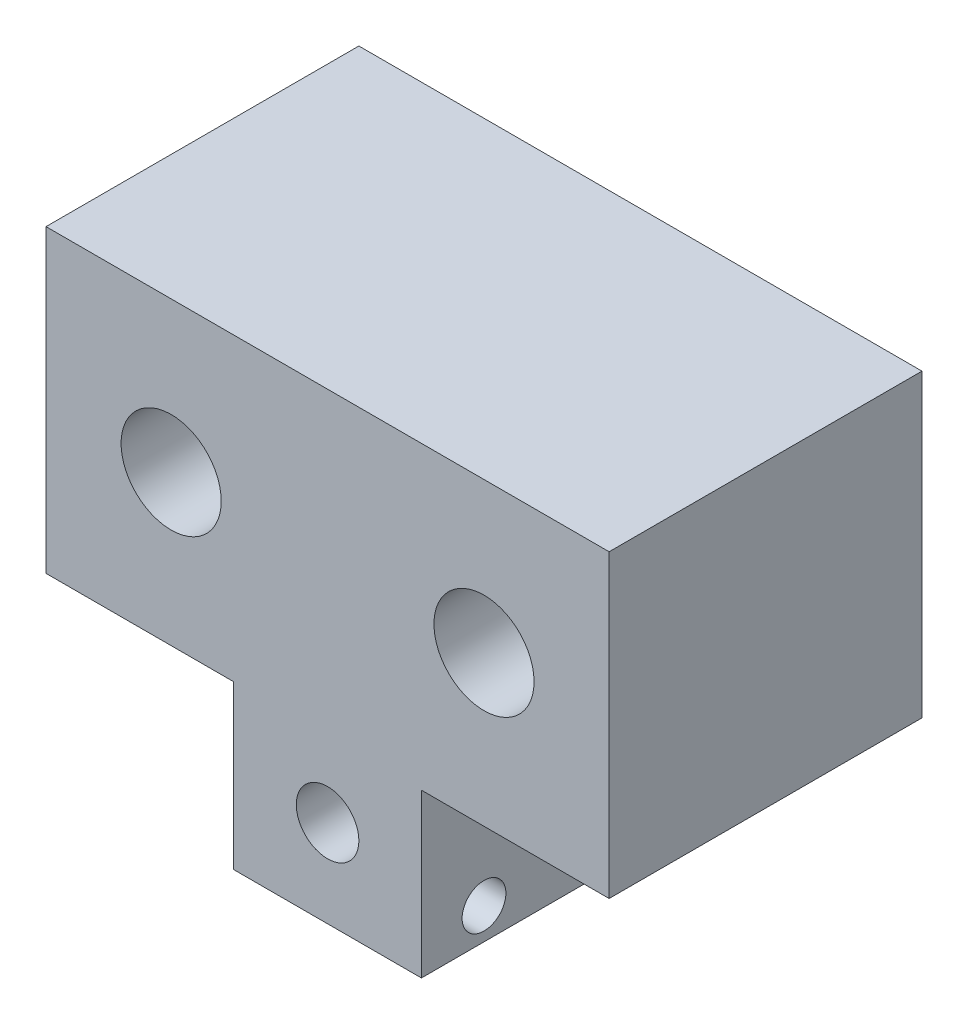
ISO-10303-21;
HEADER;
FILE_DESCRIPTION(('STEP AP214'),'2;1');
FILE_NAME('part.step','',(''),(''),'','','');
FILE_SCHEMA(('AUTOMOTIVE_DESIGN { 1 0 10303 214 1 1 1 1 }'));
ENDSEC;
DATA;
#1=APPLICATION_CONTEXT('core data for automotive mechanical design processes');
#2=APPLICATION_PROTOCOL_DEFINITION('international standard','automotive_design',2000,#1);
#3=PRODUCT_CONTEXT('',#1,'mechanical');
#4=PRODUCT('Part','Part','',(#3));
#5=PRODUCT_RELATED_PRODUCT_CATEGORY('part','',(#4));
#6=PRODUCT_DEFINITION_FORMATION('','',#4);
#7=PRODUCT_DEFINITION_CONTEXT('part definition',#1,'design');
#8=PRODUCT_DEFINITION('design','',#6,#7);
#9=PRODUCT_DEFINITION_SHAPE('','',#8);
#10=(LENGTH_UNIT() NAMED_UNIT(*) SI_UNIT(.MILLI.,.METRE.));
#11=(NAMED_UNIT(*) PLANE_ANGLE_UNIT() SI_UNIT($,.RADIAN.));
#12=(NAMED_UNIT(*) SI_UNIT($,.STERADIAN.) SOLID_ANGLE_UNIT());
#13=UNCERTAINTY_MEASURE_WITH_UNIT(LENGTH_MEASURE(1.E-05),#10,'distance_accuracy_value','');
#14=(GEOMETRIC_REPRESENTATION_CONTEXT(3) GLOBAL_UNCERTAINTY_ASSIGNED_CONTEXT((#13)) GLOBAL_UNIT_ASSIGNED_CONTEXT((#10,
#11,#12)) REPRESENTATION_CONTEXT('',''));
#15=CARTESIAN_POINT('',(0.,0.,0.));
#16=DIRECTION('',(0.,0.,1.));
#17=DIRECTION('',(1.,0.,0.));
#18=AXIS2_PLACEMENT_3D('',#15,#16,#17);
#19=CARTESIAN_POINT('',(-18.3023859270742,-12.216957605985,25.));
#20=DIRECTION('',(0.,1.,0.));
#21=DIRECTION('',(0.,0.,1.));
#22=AXIS2_PLACEMENT_3D('',#19,#20,#21);
#23=PLANE('',#22);
#24=DIRECTION('',(0.,0.,1.));
#25=VECTOR('',#24,1.);
#26=CARTESIAN_POINT('',(11.6976140729258,-12.216957605985,5.));
#27=LINE('',#26,#25);
#28=CARTESIAN_POINT('',(11.6976140729258,-12.216957605985,5.));
#29=VERTEX_POINT('',#28);
#30=CARTESIAN_POINT('',(11.6976140729258,-12.216957605985,25.));
#31=VERTEX_POINT('',#30);
#32=EDGE_CURVE('E145',#29,#31,#27,.T.);
#33=ORIENTED_EDGE('',*,*,#32,.F.);
#34=DIRECTION('',(-1.,0.,0.));
#35=VECTOR('',#34,1.);
#36=CARTESIAN_POINT('',(-3.30238592707421,-12.216957605985,5.));
#37=LINE('',#36,#35);
#38=CARTESIAN_POINT('',(-3.30238592707421,-12.216957605985,5.));
#39=VERTEX_POINT('',#38);
#40=EDGE_CURVE('E117',#29,#39,#37,.T.);
#41=ORIENTED_EDGE('',*,*,#40,.T.);
#42=DIRECTION('',(0.,0.,1.));
#43=VECTOR('',#42,1.);
#44=CARTESIAN_POINT('',(-3.30238592707421,-12.216957605985,5.));
#45=LINE('',#44,#43);
#46=CARTESIAN_POINT('',(-3.30238592707421,-12.216957605985,25.));
#47=VERTEX_POINT('',#46);
#48=EDGE_CURVE('E129',#39,#47,#45,.T.);
#49=ORIENTED_EDGE('',*,*,#48,.T.);
#50=DIRECTION('',(1.,0.,0.));
#51=VECTOR('',#50,1.);
#52=CARTESIAN_POINT('',(-18.3023859270742,-12.216957605985,25.));
#53=LINE('',#52,#51);
#54=CARTESIAN_POINT('',(-18.3023859270742,-12.216957605985,25.));
#55=VERTEX_POINT('',#54);
#56=EDGE_CURVE('E86',#55,#47,#53,.T.);
#57=ORIENTED_EDGE('',*,*,#56,.F.);
#58=DIRECTION('',(0.,0.,-1.));
#59=VECTOR('',#58,1.);
#60=CARTESIAN_POINT('',(-18.3023859270742,-12.216957605985,25.));
#61=LINE('',#60,#59);
#62=CARTESIAN_POINT('',(-18.3023859270742,-12.216957605985,0.));
#63=VERTEX_POINT('',#62);
#64=EDGE_CURVE('E11',#55,#63,#61,.T.);
#65=ORIENTED_EDGE('',*,*,#64,.T.);
#66=DIRECTION('',(1.,0.,0.));
#67=VECTOR('',#66,1.);
#68=CARTESIAN_POINT('',(-18.3023859270742,-12.216957605985,0.));
#69=LINE('',#68,#67);
#70=CARTESIAN_POINT('',(26.6976140729258,-12.216957605985,0.));
#71=VERTEX_POINT('',#70);
#72=EDGE_CURVE('E170',#63,#71,#69,.T.);
#73=ORIENTED_EDGE('',*,*,#72,.T.);
#74=DIRECTION('',(0.,0.,-1.));
#75=VECTOR('',#74,1.);
#76=CARTESIAN_POINT('',(26.6976140729258,-12.216957605985,25.));
#77=LINE('',#76,#75);
#78=CARTESIAN_POINT('',(26.6976140729258,-12.216957605985,25.));
#79=VERTEX_POINT('',#78);
#80=EDGE_CURVE('E43',#79,#71,#77,.T.);
#81=ORIENTED_EDGE('',*,*,#80,.F.);
#82=EDGE_CURVE('E162',#31,#79,#53,.T.);
#83=ORIENTED_EDGE('',*,*,#82,.F.);
#84=EDGE_LOOP('',(#33,#41,#49,#57,#65,#73,#81,#83));
#85=FACE_BOUND('',#84,.T.);
#86=ADVANCED_FACE('F34',(#85),#23,.F.);
#87=CARTESIAN_POINT('',(0.,0.,25.));
#88=DIRECTION('',(0.,0.,1.));
#89=DIRECTION('',(1.,0.,0.));
#90=AXIS2_PLACEMENT_3D('',#87,#88,#89);
#91=PLANE('',#90);
#92=CARTESIAN_POINT('',(-8.30238592707421,-0.216957605985042,25.));
#93=DIRECTION('',(0.,0.,1.));
#94=DIRECTION('',(1.,0.,0.));
#95=AXIS2_PLACEMENT_3D('',#92,#93,#94);
#96=CIRCLE('',#95,4.);
#97=CARTESIAN_POINT('',(-4.30238592707421,-0.216957605985042,25.));
#98=VERTEX_POINT('',#97);
#99=EDGE_CURVE('E154',#98,#98,#96,.T.);
#100=ORIENTED_EDGE('',*,*,#99,.F.);
#101=EDGE_LOOP('',(#100));
#102=FACE_BOUND('',#101,.T.);
#103=DIRECTION('',(0.,-1.,0.));
#104=VECTOR('',#103,1.);
#105=CARTESIAN_POINT('',(-18.3023859270742,11.783042394015,25.));
#106=LINE('',#105,#104);
#107=CARTESIAN_POINT('',(-18.3023859270742,11.783042394015,25.));
#108=VERTEX_POINT('',#107);
#109=EDGE_CURVE('E160',#108,#55,#106,.T.);
#110=ORIENTED_EDGE('',*,*,#109,.T.);
#111=ORIENTED_EDGE('',*,*,#56,.T.);
#112=DIRECTION('',(0.,-1.,0.));
#113=VECTOR('',#112,1.);
#114=CARTESIAN_POINT('',(-3.30238592707421,-25.216957605985,25.));
#115=LINE('',#114,#113);
#116=CARTESIAN_POINT('',(-3.30238592707421,-25.216957605985,25.));
#117=VERTEX_POINT('',#116);
#118=EDGE_CURVE('E50',#47,#117,#115,.T.);
#119=ORIENTED_EDGE('',*,*,#118,.T.);
#120=DIRECTION('',(1.,0.,0.));
#121=VECTOR('',#120,1.);
#122=CARTESIAN_POINT('',(-3.30238592707421,-25.216957605985,25.));
#123=LINE('',#122,#121);
#124=CARTESIAN_POINT('',(11.6976140729258,-25.216957605985,25.));
#125=VERTEX_POINT('',#124);
#126=EDGE_CURVE('E114',#117,#125,#123,.T.);
#127=ORIENTED_EDGE('',*,*,#126,.T.);
#128=DIRECTION('',(0.,1.,0.));
#129=VECTOR('',#128,1.);
#130=CARTESIAN_POINT('',(11.6976140729258,-25.216957605985,25.));
#131=LINE('',#130,#129);
#132=EDGE_CURVE('E130',#125,#31,#131,.T.);
#133=ORIENTED_EDGE('',*,*,#132,.T.);
#134=ORIENTED_EDGE('',*,*,#82,.T.);
#135=DIRECTION('',(0.,1.,0.));
#136=VECTOR('',#135,1.);
#137=CARTESIAN_POINT('',(26.6976140729258,11.783042394015,25.));
#138=LINE('',#137,#136);
#139=CARTESIAN_POINT('',(26.6976140729258,11.783042394015,25.));
#140=VERTEX_POINT('',#139);
#141=EDGE_CURVE('E164',#79,#140,#138,.T.);
#142=ORIENTED_EDGE('',*,*,#141,.T.);
#143=DIRECTION('',(-1.,0.,0.));
#144=VECTOR('',#143,1.);
#145=CARTESIAN_POINT('',(-18.3023859270742,11.783042394015,25.));
#146=LINE('',#145,#144);
#147=EDGE_CURVE('E59',#140,#108,#146,.T.);
#148=ORIENTED_EDGE('',*,*,#147,.T.);
#149=EDGE_LOOP('',(#110,#111,#119,#127,#133,#134,#142,#148));
#150=FACE_BOUND('',#149,.T.);
#151=CARTESIAN_POINT('',(16.6976140729258,-0.216957605985042,25.));
#152=DIRECTION('',(0.,0.,1.));
#153=DIRECTION('',(1.,0.,0.));
#154=AXIS2_PLACEMENT_3D('',#151,#152,#153);
#155=CIRCLE('',#154,4.);
#156=CARTESIAN_POINT('',(20.6976140729258,-0.216957605985042,25.));
#157=VERTEX_POINT('',#156);
#158=EDGE_CURVE('E148',#157,#157,#155,.T.);
#159=ORIENTED_EDGE('',*,*,#158,.F.);
#160=EDGE_LOOP('',(#159));
#161=FACE_BOUND('',#160,.T.);
#162=CARTESIAN_POINT('',(4.19761407292579,-18.216957605985,25.));
#163=DIRECTION('',(0.,0.,1.));
#164=DIRECTION('',(1.,0.,0.));
#165=AXIS2_PLACEMENT_3D('',#162,#163,#164);
#166=CIRCLE('',#165,2.5);
#167=CARTESIAN_POINT('',(6.69761407292579,-18.216957605985,25.));
#168=VERTEX_POINT('',#167);
#169=EDGE_CURVE('E135',#168,#168,#166,.T.);
#170=ORIENTED_EDGE('',*,*,#169,.F.);
#171=EDGE_LOOP('',(#170));
#172=FACE_BOUND('',#171,.T.);
#173=ADVANCED_FACE('F207',(#102,#150,#161,#172),#91,.T.);
#174=CARTESIAN_POINT('',(0.,0.,0.));
#175=DIRECTION('',(0.,0.,1.));
#176=DIRECTION('',(1.,0.,0.));
#177=AXIS2_PLACEMENT_3D('',#174,#175,#176);
#178=PLANE('',#177);
#179=DIRECTION('',(0.,-1.,0.));
#180=VECTOR('',#179,1.);
#181=CARTESIAN_POINT('',(-18.3023859270742,11.783042394015,0.));
#182=LINE('',#181,#180);
#183=CARTESIAN_POINT('',(-18.3023859270742,11.783042394015,0.));
#184=VERTEX_POINT('',#183);
#185=EDGE_CURVE('E157',#184,#63,#182,.T.);
#186=ORIENTED_EDGE('',*,*,#185,.F.);
#187=DIRECTION('',(-1.,0.,0.));
#188=VECTOR('',#187,1.);
#189=CARTESIAN_POINT('',(-18.3023859270742,11.783042394015,0.));
#190=LINE('',#189,#188);
#191=CARTESIAN_POINT('',(26.6976140729258,11.783042394015,0.));
#192=VERTEX_POINT('',#191);
#193=EDGE_CURVE('E80',#192,#184,#190,.T.);
#194=ORIENTED_EDGE('',*,*,#193,.F.);
#195=DIRECTION('',(0.,1.,0.));
#196=VECTOR('',#195,1.);
#197=CARTESIAN_POINT('',(26.6976140729258,11.783042394015,0.));
#198=LINE('',#197,#196);
#199=EDGE_CURVE('E172',#71,#192,#198,.T.);
#200=ORIENTED_EDGE('',*,*,#199,.F.);
#201=ORIENTED_EDGE('',*,*,#72,.F.);
#202=EDGE_LOOP('',(#186,#194,#200,#201));
#203=FACE_BOUND('',#202,.T.);
#204=CARTESIAN_POINT('',(-8.30238592707421,-0.216957605985042,0.));
#205=DIRECTION('',(0.,0.,1.));
#206=DIRECTION('',(1.,0.,0.));
#207=AXIS2_PLACEMENT_3D('',#204,#205,#206);
#208=CIRCLE('',#207,4.);
#209=CARTESIAN_POINT('',(-4.30238592707421,-0.216957605985042,0.));
#210=VERTEX_POINT('',#209);
#211=EDGE_CURVE('E151',#210,#210,#208,.T.);
#212=ORIENTED_EDGE('',*,*,#211,.T.);
#213=EDGE_LOOP('',(#212));
#214=FACE_BOUND('',#213,.T.);
#215=CARTESIAN_POINT('',(16.6976140729258,-0.216957605985042,0.));
#216=DIRECTION('',(0.,0.,1.));
#217=DIRECTION('',(1.,0.,0.));
#218=AXIS2_PLACEMENT_3D('',#215,#216,#217);
#219=CIRCLE('',#218,4.);
#220=CARTESIAN_POINT('',(20.6976140729258,-0.216957605985042,0.));
#221=VERTEX_POINT('',#220);
#222=EDGE_CURVE('E144',#221,#221,#219,.T.);
#223=ORIENTED_EDGE('',*,*,#222,.T.);
#224=EDGE_LOOP('',(#223));
#225=FACE_BOUND('',#224,.T.);
#226=ADVANCED_FACE('F188',(#203,#214,#225),#178,.F.);
#227=CARTESIAN_POINT('',(-18.3023859270742,11.783042394015,25.));
#228=DIRECTION('',(1.,0.,0.));
#229=DIRECTION('',(0.,0.,-1.));
#230=AXIS2_PLACEMENT_3D('',#227,#228,#229);
#231=PLANE('',#230);
#232=ORIENTED_EDGE('',*,*,#185,.T.);
#233=ORIENTED_EDGE('',*,*,#64,.F.);
#234=ORIENTED_EDGE('',*,*,#109,.F.);
#235=DIRECTION('',(0.,0.,-1.));
#236=VECTOR('',#235,1.);
#237=CARTESIAN_POINT('',(-18.3023859270742,11.783042394015,25.));
#238=LINE('',#237,#236);
#239=EDGE_CURVE('E167',#108,#184,#238,.T.);
#240=ORIENTED_EDGE('',*,*,#239,.T.);
#241=EDGE_LOOP('',(#232,#233,#234,#240));
#242=FACE_BOUND('',#241,.T.);
#243=ADVANCED_FACE('F36',(#242),#231,.F.);
#244=CARTESIAN_POINT('',(26.6976140729258,11.783042394015,25.));
#245=DIRECTION('',(-1.,0.,0.));
#246=DIRECTION('',(0.,-1.,0.));
#247=AXIS2_PLACEMENT_3D('',#244,#245,#246);
#248=PLANE('',#247);
#249=ORIENTED_EDGE('',*,*,#199,.T.);
#250=DIRECTION('',(0.,0.,-1.));
#251=VECTOR('',#250,1.);
#252=CARTESIAN_POINT('',(26.6976140729258,11.783042394015,25.));
#253=LINE('',#252,#251);
#254=EDGE_CURVE('E176',#140,#192,#253,.T.);
#255=ORIENTED_EDGE('',*,*,#254,.F.);
#256=ORIENTED_EDGE('',*,*,#141,.F.);
#257=ORIENTED_EDGE('',*,*,#80,.T.);
#258=EDGE_LOOP('',(#249,#255,#256,#257));
#259=FACE_BOUND('',#258,.T.);
#260=ADVANCED_FACE('F183',(#259),#248,.F.);
#261=CARTESIAN_POINT('',(-18.3023859270742,11.783042394015,25.));
#262=DIRECTION('',(0.,-1.,0.));
#263=DIRECTION('',(0.,0.,-1.));
#264=AXIS2_PLACEMENT_3D('',#261,#262,#263);
#265=PLANE('',#264);
#266=ORIENTED_EDGE('',*,*,#193,.T.);
#267=ORIENTED_EDGE('',*,*,#239,.F.);
#268=ORIENTED_EDGE('',*,*,#147,.F.);
#269=ORIENTED_EDGE('',*,*,#254,.T.);
#270=EDGE_LOOP('',(#266,#267,#268,#269));
#271=FACE_BOUND('',#270,.T.);
#272=ADVANCED_FACE('F193',(#271),#265,.F.);
#273=CARTESIAN_POINT('',(-8.30238592707421,-0.216957605985042,25.));
#274=DIRECTION('',(0.,0.,-1.));
#275=DIRECTION('',(-1.,0.,0.));
#276=AXIS2_PLACEMENT_3D('',#273,#274,#275);
#277=CYLINDRICAL_SURFACE('',#276,4.);
#278=ORIENTED_EDGE('',*,*,#99,.T.);
#279=EDGE_LOOP('',(#278));
#280=FACE_BOUND('',#279,.T.);
#281=ORIENTED_EDGE('',*,*,#211,.F.);
#282=EDGE_LOOP('',(#281));
#283=FACE_BOUND('',#282,.T.);
#284=ADVANCED_FACE('F195',(#280,#283),#277,.F.);
#285=CARTESIAN_POINT('',(16.6976140729258,-0.216957605985042,25.));
#286=DIRECTION('',(0.,0.,-1.));
#287=DIRECTION('',(-1.,0.,0.));
#288=AXIS2_PLACEMENT_3D('',#285,#286,#287);
#289=CYLINDRICAL_SURFACE('',#288,4.);
#290=ORIENTED_EDGE('',*,*,#158,.T.);
#291=EDGE_LOOP('',(#290));
#292=FACE_BOUND('',#291,.T.);
#293=ORIENTED_EDGE('',*,*,#222,.F.);
#294=EDGE_LOOP('',(#293));
#295=FACE_BOUND('',#294,.T.);
#296=ADVANCED_FACE('F201',(#292,#295),#289,.F.);
#297=CARTESIAN_POINT('',(-3.30238592707421,-25.216957605985,5.));
#298=DIRECTION('',(-1.,0.,0.));
#299=DIRECTION('',(0.,0.,1.));
#300=AXIS2_PLACEMENT_3D('',#297,#298,#299);
#301=PLANE('',#300);
#302=CARTESIAN_POINT('',(-3.30238592707421,-22.716957605985,20.));
#303=DIRECTION('',(-1.,0.,0.));
#304=DIRECTION('',(0.,0.,1.));
#305=AXIS2_PLACEMENT_3D('',#302,#303,#304);
#306=CIRCLE('',#305,1.75);
#307=CARTESIAN_POINT('',(-3.30238592707421,-22.716957605985,21.75));
#308=VERTEX_POINT('',#307);
#309=EDGE_CURVE('E225',#308,#308,#306,.T.);
#310=ORIENTED_EDGE('',*,*,#309,.F.);
#311=EDGE_LOOP('',(#310));
#312=FACE_BOUND('',#311,.T.);
#313=ORIENTED_EDGE('',*,*,#118,.F.);
#314=ORIENTED_EDGE('',*,*,#48,.F.);
#315=DIRECTION('',(0.,-1.,0.));
#316=VECTOR('',#315,1.);
#317=CARTESIAN_POINT('',(-3.30238592707421,-25.216957605985,5.));
#318=LINE('',#317,#316);
#319=CARTESIAN_POINT('',(-3.30238592707421,-25.216957605985,5.));
#320=VERTEX_POINT('',#319);
#321=EDGE_CURVE('E124',#39,#320,#318,.T.);
#322=ORIENTED_EDGE('',*,*,#321,.T.);
#323=DIRECTION('',(0.,0.,1.));
#324=VECTOR('',#323,1.);
#325=CARTESIAN_POINT('',(-3.30238592707421,-25.216957605985,5.));
#326=LINE('',#325,#324);
#327=EDGE_CURVE('E109',#320,#117,#326,.T.);
#328=ORIENTED_EDGE('',*,*,#327,.T.);
#329=EDGE_LOOP('',(#313,#314,#322,#328));
#330=FACE_BOUND('',#329,.T.);
#331=ADVANCED_FACE('F128',(#312,#330),#301,.T.);
#332=CARTESIAN_POINT('',(11.6976140729258,-25.216957605985,5.));
#333=DIRECTION('',(1.,0.,0.));
#334=DIRECTION('',(0.,0.,-1.));
#335=AXIS2_PLACEMENT_3D('',#332,#333,#334);
#336=PLANE('',#335);
#337=CARTESIAN_POINT('',(11.6976140729258,-22.716957605985,20.));
#338=DIRECTION('',(1.,0.,0.));
#339=DIRECTION('',(0.,0.,-1.));
#340=AXIS2_PLACEMENT_3D('',#337,#338,#339);
#341=CIRCLE('',#340,1.75);
#342=CARTESIAN_POINT('',(11.6976140729258,-22.716957605985,18.25));
#343=VERTEX_POINT('',#342);
#344=EDGE_CURVE('E38',#343,#343,#341,.T.);
#345=ORIENTED_EDGE('',*,*,#344,.F.);
#346=EDGE_LOOP('',(#345));
#347=FACE_BOUND('',#346,.T.);
#348=ORIENTED_EDGE('',*,*,#132,.F.);
#349=DIRECTION('',(0.,0.,1.));
#350=VECTOR('',#349,1.);
#351=CARTESIAN_POINT('',(11.6976140729258,-25.216957605985,5.));
#352=LINE('',#351,#350);
#353=CARTESIAN_POINT('',(11.6976140729258,-25.216957605985,5.));
#354=VERTEX_POINT('',#353);
#355=EDGE_CURVE('E116',#354,#125,#352,.T.);
#356=ORIENTED_EDGE('',*,*,#355,.F.);
#357=DIRECTION('',(0.,1.,0.));
#358=VECTOR('',#357,1.);
#359=CARTESIAN_POINT('',(11.6976140729258,-25.216957605985,5.));
#360=LINE('',#359,#358);
#361=EDGE_CURVE('E126',#354,#29,#360,.T.);
#362=ORIENTED_EDGE('',*,*,#361,.T.);
#363=ORIENTED_EDGE('',*,*,#32,.T.);
#364=EDGE_LOOP('',(#348,#356,#362,#363));
#365=FACE_BOUND('',#364,.T.);
#366=ADVANCED_FACE('F216',(#347,#365),#336,.T.);
#367=CARTESIAN_POINT('',(-3.30238592707421,-25.216957605985,5.));
#368=DIRECTION('',(0.,-1.,0.));
#369=DIRECTION('',(0.,0.,-1.));
#370=AXIS2_PLACEMENT_3D('',#367,#368,#369);
#371=PLANE('',#370);
#372=ORIENTED_EDGE('',*,*,#126,.F.);
#373=ORIENTED_EDGE('',*,*,#327,.F.);
#374=DIRECTION('',(1.,0.,0.));
#375=VECTOR('',#374,1.);
#376=CARTESIAN_POINT('',(-3.30238592707421,-25.216957605985,5.));
#377=LINE('',#376,#375);
#378=EDGE_CURVE('E112',#320,#354,#377,.T.);
#379=ORIENTED_EDGE('',*,*,#378,.T.);
#380=ORIENTED_EDGE('',*,*,#355,.T.);
#381=EDGE_LOOP('',(#372,#373,#379,#380));
#382=FACE_BOUND('',#381,.T.);
#383=ADVANCED_FACE('F111',(#382),#371,.T.);
#384=CARTESIAN_POINT('',(0.,0.,5.));
#385=DIRECTION('',(0.,0.,-1.));
#386=DIRECTION('',(-1.,0.,0.));
#387=AXIS2_PLACEMENT_3D('',#384,#385,#386);
#388=PLANE('',#387);
#389=CARTESIAN_POINT('',(4.19761407292579,-18.216957605985,5.));
#390=DIRECTION('',(0.,0.,1.));
#391=DIRECTION('',(1.,0.,0.));
#392=AXIS2_PLACEMENT_3D('',#389,#390,#391);
#393=CIRCLE('',#392,2.5);
#394=CARTESIAN_POINT('',(6.69761407292579,-18.216957605985,5.));
#395=VERTEX_POINT('',#394);
#396=EDGE_CURVE('E141',#395,#395,#393,.T.);
#397=ORIENTED_EDGE('',*,*,#396,.T.);
#398=EDGE_LOOP('',(#397));
#399=FACE_BOUND('',#398,.T.);
#400=ORIENTED_EDGE('',*,*,#321,.F.);
#401=ORIENTED_EDGE('',*,*,#40,.F.);
#402=ORIENTED_EDGE('',*,*,#361,.F.);
#403=ORIENTED_EDGE('',*,*,#378,.F.);
#404=EDGE_LOOP('',(#400,#401,#402,#403));
#405=FACE_BOUND('',#404,.T.);
#406=ADVANCED_FACE('F122',(#399,#405),#388,.T.);
#407=CARTESIAN_POINT('',(4.19761407292579,-18.216957605985,5.));
#408=DIRECTION('',(0.,0.,1.));
#409=DIRECTION('',(1.,0.,0.));
#410=AXIS2_PLACEMENT_3D('',#407,#408,#409);
#411=CYLINDRICAL_SURFACE('',#410,2.5);
#412=ORIENTED_EDGE('',*,*,#396,.F.);
#413=EDGE_LOOP('',(#412));
#414=FACE_BOUND('',#413,.T.);
#415=ORIENTED_EDGE('',*,*,#169,.T.);
#416=EDGE_LOOP('',(#415));
#417=FACE_BOUND('',#416,.T.);
#418=ADVANCED_FACE('F300',(#414,#417),#411,.F.);
#419=CARTESIAN_POINT('',(16.6976140729258,-22.716957605985,20.));
#420=DIRECTION('',(-1.,0.,0.));
#421=DIRECTION('',(0.,0.,1.));
#422=AXIS2_PLACEMENT_3D('',#419,#420,#421);
#423=CYLINDRICAL_SURFACE('',#422,1.75);
#424=ORIENTED_EDGE('',*,*,#344,.T.);
#425=EDGE_LOOP('',(#424));
#426=FACE_BOUND('',#425,.T.);
#427=ORIENTED_EDGE('',*,*,#309,.T.);
#428=EDGE_LOOP('',(#427));
#429=FACE_BOUND('',#428,.T.);
#430=ADVANCED_FACE('F232',(#426,#429),#423,.F.);
#431=CLOSED_SHELL('',(#86,#173,#226,#243,#260,#272,#284,#296,#331,#366,#383,#406,#418,#430));
#432=MANIFOLD_SOLID_BREP('B2',#431);
#433=ADVANCED_BREP_SHAPE_REPRESENTATION('',(#18,#432),#14);
#434=SHAPE_DEFINITION_REPRESENTATION(#9,#433);
ENDSEC;
END-ISO-10303-21;
